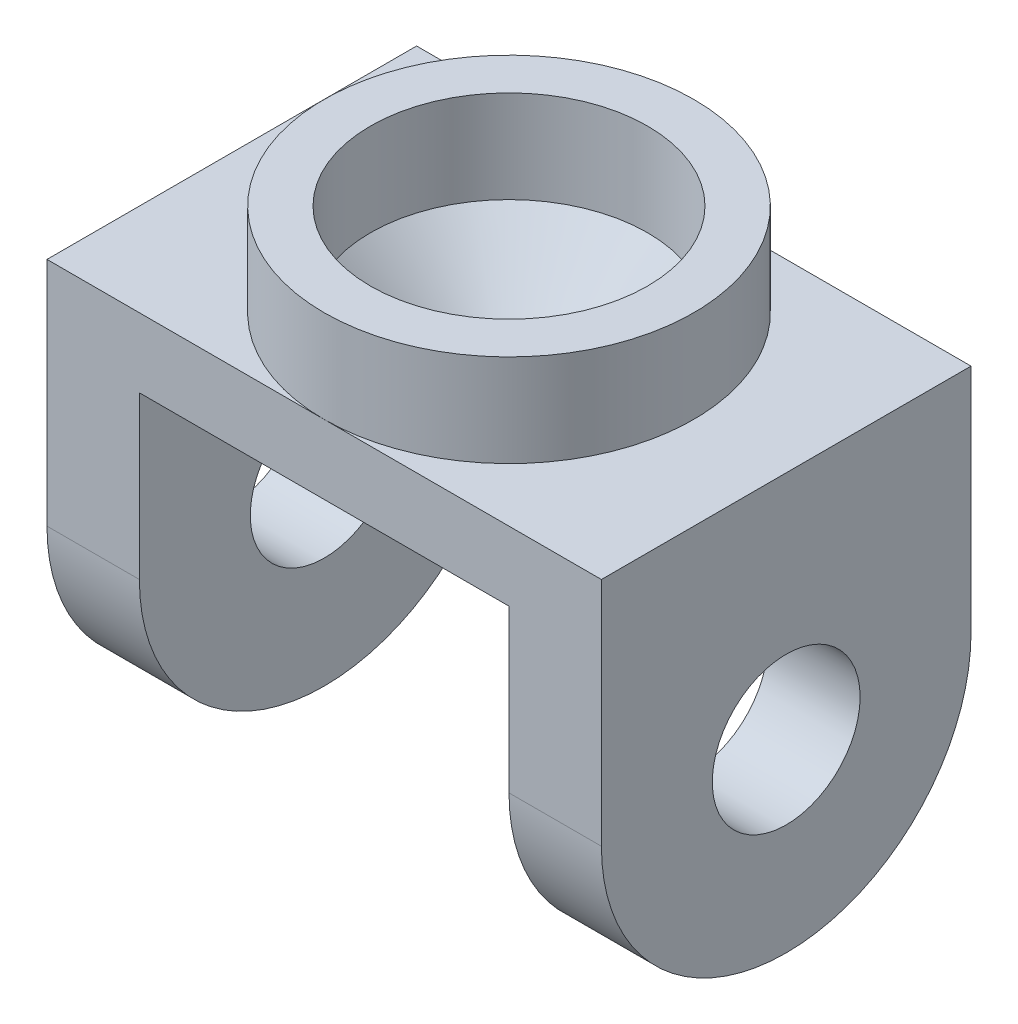
ISO-10303-21;
HEADER;
FILE_DESCRIPTION(('STEP AP214'),'2;1');
FILE_NAME('part.step','',(''),(''),'','','');
FILE_SCHEMA(('AUTOMOTIVE_DESIGN { 1 0 10303 214 1 1 1 1 }'));
ENDSEC;
DATA;
#1=APPLICATION_CONTEXT('core data for automotive mechanical design processes');
#2=APPLICATION_PROTOCOL_DEFINITION('international standard','automotive_design',2000,#1);
#3=PRODUCT_CONTEXT('',#1,'mechanical');
#4=PRODUCT('Part','Part','',(#3));
#5=PRODUCT_RELATED_PRODUCT_CATEGORY('part','',(#4));
#6=PRODUCT_DEFINITION_FORMATION('','',#4);
#7=PRODUCT_DEFINITION_CONTEXT('part definition',#1,'design');
#8=PRODUCT_DEFINITION('design','',#6,#7);
#9=PRODUCT_DEFINITION_SHAPE('','',#8);
#10=(LENGTH_UNIT() NAMED_UNIT(*) SI_UNIT(.MILLI.,.METRE.));
#11=(NAMED_UNIT(*) PLANE_ANGLE_UNIT() SI_UNIT($,.RADIAN.));
#12=(NAMED_UNIT(*) SI_UNIT($,.STERADIAN.) SOLID_ANGLE_UNIT());
#13=UNCERTAINTY_MEASURE_WITH_UNIT(LENGTH_MEASURE(1.E-05),#10,'distance_accuracy_value','');
#14=(GEOMETRIC_REPRESENTATION_CONTEXT(3) GLOBAL_UNCERTAINTY_ASSIGNED_CONTEXT((#13)) GLOBAL_UNIT_ASSIGNED_CONTEXT((#10,
#11,#12)) REPRESENTATION_CONTEXT('',''));
#15=CARTESIAN_POINT('',(0.,0.,0.));
#16=DIRECTION('',(0.,0.,1.));
#17=DIRECTION('',(1.,0.,0.));
#18=AXIS2_PLACEMENT_3D('',#15,#16,#17);
#19=CARTESIAN_POINT('',(0.,228.6,0.));
#20=DIRECTION('',(0.,-1.,0.));
#21=DIRECTION('',(0.,0.,-1.));
#22=AXIS2_PLACEMENT_3D('',#19,#20,#21);
#23=PLANE('',#22);
#24=CARTESIAN_POINT('',(0.,228.6,0.));
#25=DIRECTION('',(0.,1.,0.));
#26=DIRECTION('',(0.,0.,1.));
#27=AXIS2_PLACEMENT_3D('',#24,#25,#26);
#28=CIRCLE('',#27,101.6);
#29=CARTESIAN_POINT('',(0.,228.6,101.6));
#30=VERTEX_POINT('',#29);
#31=CARTESIAN_POINT('',(0.,228.6,-101.6));
#32=VERTEX_POINT('',#31);
#33=EDGE_CURVE('E165',#30,#32,#28,.T.);
#34=ORIENTED_EDGE('',*,*,#33,.F.);
#35=DIRECTION('',(1.,0.,0.));
#36=VECTOR('',#35,1.);
#37=CARTESIAN_POINT('',(-152.4,228.6,101.6));
#38=LINE('',#37,#36);
#39=CARTESIAN_POINT('',(152.4,228.6,101.6));
#40=VERTEX_POINT('',#39);
#41=EDGE_CURVE('E178',#30,#40,#38,.T.);
#42=ORIENTED_EDGE('',*,*,#41,.T.);
#43=DIRECTION('',(0.,0.,-1.));
#44=VECTOR('',#43,1.);
#45=CARTESIAN_POINT('',(152.4,228.6,101.6));
#46=LINE('',#45,#44);
#47=CARTESIAN_POINT('',(152.4,228.6,-101.6));
#48=VERTEX_POINT('',#47);
#49=EDGE_CURVE('E169',#40,#48,#46,.T.);
#50=ORIENTED_EDGE('',*,*,#49,.T.);
#51=DIRECTION('',(-1.,0.,0.));
#52=VECTOR('',#51,1.);
#53=CARTESIAN_POINT('',(-152.4,228.6,-101.6));
#54=LINE('',#53,#52);
#55=EDGE_CURVE('E175',#48,#32,#54,.T.);
#56=ORIENTED_EDGE('',*,*,#55,.T.);
#57=EDGE_LOOP('',(#34,#42,#50,#56));
#58=FACE_BOUND('',#57,.T.);
#59=ADVANCED_FACE('F41',(#58),#23,.F.);
#60=CARTESIAN_POINT('',(152.4,228.6,101.6));
#61=DIRECTION('',(-1.,0.,0.));
#62=DIRECTION('',(0.,0.,1.));
#63=AXIS2_PLACEMENT_3D('',#60,#61,#62);
#64=PLANE('',#63);
#65=CARTESIAN_POINT('',(152.4,101.6,0.));
#66=DIRECTION('',(1.,0.,0.));
#67=DIRECTION('',(0.,0.,-1.));
#68=AXIS2_PLACEMENT_3D('',#65,#66,#67);
#69=CIRCLE('',#68,40.64);
#70=CARTESIAN_POINT('',(152.4,101.6,-40.64));
#71=VERTEX_POINT('',#70);
#72=EDGE_CURVE('E219',#71,#71,#69,.T.);
#73=ORIENTED_EDGE('',*,*,#72,.F.);
#74=EDGE_LOOP('',(#73));
#75=FACE_BOUND('',#74,.T.);
#76=CARTESIAN_POINT('',(152.4,101.6,0.));
#77=DIRECTION('',(-1.,0.,0.));
#78=DIRECTION('',(0.,0.,1.));
#79=AXIS2_PLACEMENT_3D('',#76,#77,#78);
#80=CIRCLE('',#79,101.6);
#81=CARTESIAN_POINT('',(152.4,101.6,101.6));
#82=VERTEX_POINT('',#81);
#83=CARTESIAN_POINT('',(152.4,0.,0.));
#84=VERTEX_POINT('',#83);
#85=EDGE_CURVE('E208',#82,#84,#80,.F.);
#86=ORIENTED_EDGE('',*,*,#85,.T.);
#87=CARTESIAN_POINT('',(152.4,101.6,0.));
#88=DIRECTION('',(-1.,0.,0.));
#89=DIRECTION('',(0.,0.,1.));
#90=AXIS2_PLACEMENT_3D('',#87,#88,#89);
#91=CIRCLE('',#90,101.6);
#92=CARTESIAN_POINT('',(152.4,101.6,-101.6));
#93=VERTEX_POINT('',#92);
#94=EDGE_CURVE('E209',#84,#93,#91,.F.);
#95=ORIENTED_EDGE('',*,*,#94,.T.);
#96=DIRECTION('',(0.,-1.,0.));
#97=VECTOR('',#96,1.);
#98=CARTESIAN_POINT('',(152.4,228.6,-101.6));
#99=LINE('',#98,#97);
#100=EDGE_CURVE('E190',#48,#93,#99,.T.);
#101=ORIENTED_EDGE('',*,*,#100,.F.);
#102=ORIENTED_EDGE('',*,*,#49,.F.);
#103=DIRECTION('',(0.,-1.,0.));
#104=VECTOR('',#103,1.);
#105=CARTESIAN_POINT('',(152.4,228.6,101.6));
#106=LINE('',#105,#104);
#107=EDGE_CURVE('E181',#40,#82,#106,.T.);
#108=ORIENTED_EDGE('',*,*,#107,.T.);
#109=EDGE_LOOP('',(#86,#95,#101,#102,#108));
#110=FACE_BOUND('',#109,.T.);
#111=ADVANCED_FACE('F281',(#75,#110),#64,.F.);
#112=CARTESIAN_POINT('',(-152.4,228.6,-101.6));
#113=DIRECTION('',(0.,0.,1.));
#114=DIRECTION('',(1.,0.,0.));
#115=AXIS2_PLACEMENT_3D('',#112,#113,#114);
#116=PLANE('',#115);
#117=ORIENTED_EDGE('',*,*,#100,.T.);
#118=DIRECTION('',(-1.,0.,0.));
#119=VECTOR('',#118,1.);
#120=CARTESIAN_POINT('',(101.6,101.6,-101.6));
#121=LINE('',#120,#119);
#122=CARTESIAN_POINT('',(101.6,101.6,-101.6));
#123=VERTEX_POINT('',#122);
#124=EDGE_CURVE('E203',#93,#123,#121,.T.);
#125=ORIENTED_EDGE('',*,*,#124,.T.);
#126=DIRECTION('',(0.,-1.,0.));
#127=VECTOR('',#126,1.);
#128=CARTESIAN_POINT('',(101.6,190.5,-101.6));
#129=LINE('',#128,#127);
#130=CARTESIAN_POINT('',(101.6,190.5,-101.6));
#131=VERTEX_POINT('',#130);
#132=EDGE_CURVE('E147',#131,#123,#129,.T.);
#133=ORIENTED_EDGE('',*,*,#132,.F.);
#134=DIRECTION('',(1.,0.,0.));
#135=VECTOR('',#134,1.);
#136=CARTESIAN_POINT('',(-101.6,190.5,-101.6));
#137=LINE('',#136,#135);
#138=CARTESIAN_POINT('',(-101.6,190.5,-101.6));
#139=VERTEX_POINT('',#138);
#140=EDGE_CURVE('E133',#139,#131,#137,.T.);
#141=ORIENTED_EDGE('',*,*,#140,.F.);
#142=DIRECTION('',(0.,-1.,0.));
#143=VECTOR('',#142,1.);
#144=CARTESIAN_POINT('',(-101.6,190.5,-101.6));
#145=LINE('',#144,#143);
#146=CARTESIAN_POINT('',(-101.6,101.6,-101.6));
#147=VERTEX_POINT('',#146);
#148=EDGE_CURVE('E128',#139,#147,#145,.T.);
#149=ORIENTED_EDGE('',*,*,#148,.T.);
#150=DIRECTION('',(-1.,0.,0.));
#151=VECTOR('',#150,1.);
#152=CARTESIAN_POINT('',(-152.4,101.6,-101.6));
#153=LINE('',#152,#151);
#154=CARTESIAN_POINT('',(-152.4,101.6,-101.6));
#155=VERTEX_POINT('',#154);
#156=EDGE_CURVE('E196',#147,#155,#153,.T.);
#157=ORIENTED_EDGE('',*,*,#156,.T.);
#158=DIRECTION('',(0.,-1.,0.));
#159=VECTOR('',#158,1.);
#160=CARTESIAN_POINT('',(-152.4,228.6,-101.6));
#161=LINE('',#160,#159);
#162=CARTESIAN_POINT('',(-152.4,228.6,-101.6));
#163=VERTEX_POINT('',#162);
#164=EDGE_CURVE('E189',#163,#155,#161,.T.);
#165=ORIENTED_EDGE('',*,*,#164,.F.);
#166=EDGE_CURVE('E173',#32,#163,#54,.T.);
#167=ORIENTED_EDGE('',*,*,#166,.F.);
#168=ORIENTED_EDGE('',*,*,#55,.F.);
#169=EDGE_LOOP('',(#117,#125,#133,#141,#149,#157,#165,#167,#168));
#170=FACE_BOUND('',#169,.T.);
#171=ADVANCED_FACE('F247',(#170),#116,.F.);
#172=CARTESIAN_POINT('',(-152.4,228.6,101.6));
#173=DIRECTION('',(1.,0.,0.));
#174=DIRECTION('',(0.,0.,-1.));
#175=AXIS2_PLACEMENT_3D('',#172,#173,#174);
#176=PLANE('',#175);
#177=CARTESIAN_POINT('',(-152.4,101.6,0.));
#178=DIRECTION('',(1.,0.,0.));
#179=DIRECTION('',(0.,0.,-1.));
#180=AXIS2_PLACEMENT_3D('',#177,#178,#179);
#181=CIRCLE('',#180,40.64);
#182=CARTESIAN_POINT('',(-152.4,101.6,-40.64));
#183=VERTEX_POINT('',#182);
#184=EDGE_CURVE('E197',#183,#183,#181,.T.);
#185=ORIENTED_EDGE('',*,*,#184,.T.);
#186=EDGE_LOOP('',(#185));
#187=FACE_BOUND('',#186,.T.);
#188=ORIENTED_EDGE('',*,*,#164,.T.);
#189=CARTESIAN_POINT('',(-152.4,101.6,0.));
#190=DIRECTION('',(1.,0.,0.));
#191=DIRECTION('',(0.,0.,-1.));
#192=AXIS2_PLACEMENT_3D('',#189,#190,#191);
#193=CIRCLE('',#192,101.6);
#194=CARTESIAN_POINT('',(-152.4,0.,0.));
#195=VERTEX_POINT('',#194);
#196=EDGE_CURVE('E65',#155,#195,#193,.F.);
#197=ORIENTED_EDGE('',*,*,#196,.T.);
#198=CARTESIAN_POINT('',(-152.4,101.6,0.));
#199=DIRECTION('',(1.,0.,0.));
#200=DIRECTION('',(0.,0.,-1.));
#201=AXIS2_PLACEMENT_3D('',#198,#199,#200);
#202=CIRCLE('',#201,101.6);
#203=CARTESIAN_POINT('',(-152.4,101.6,101.6));
#204=VERTEX_POINT('',#203);
#205=EDGE_CURVE('E214',#195,#204,#202,.F.);
#206=ORIENTED_EDGE('',*,*,#205,.T.);
#207=DIRECTION('',(0.,-1.,0.));
#208=VECTOR('',#207,1.);
#209=CARTESIAN_POINT('',(-152.4,228.6,101.6));
#210=LINE('',#209,#208);
#211=CARTESIAN_POINT('',(-152.4,228.6,101.6));
#212=VERTEX_POINT('',#211);
#213=EDGE_CURVE('E186',#212,#204,#210,.T.);
#214=ORIENTED_EDGE('',*,*,#213,.F.);
#215=DIRECTION('',(0.,0.,1.));
#216=VECTOR('',#215,1.);
#217=CARTESIAN_POINT('',(-152.4,228.6,101.6));
#218=LINE('',#217,#216);
#219=EDGE_CURVE('E179',#163,#212,#218,.T.);
#220=ORIENTED_EDGE('',*,*,#219,.F.);
#221=EDGE_LOOP('',(#188,#197,#206,#214,#220));
#222=FACE_BOUND('',#221,.T.);
#223=ADVANCED_FACE('F231',(#187,#222),#176,.F.);
#224=CARTESIAN_POINT('',(-152.4,228.6,101.6));
#225=DIRECTION('',(0.,0.,-1.));
#226=DIRECTION('',(-1.,0.,0.));
#227=AXIS2_PLACEMENT_3D('',#224,#225,#226);
#228=PLANE('',#227);
#229=DIRECTION('',(0.,-1.,0.));
#230=VECTOR('',#229,1.);
#231=CARTESIAN_POINT('',(101.6,190.5,101.6));
#232=LINE('',#231,#230);
#233=CARTESIAN_POINT('',(101.6,190.5,101.6));
#234=VERTEX_POINT('',#233);
#235=CARTESIAN_POINT('',(101.6,101.6,101.6));
#236=VERTEX_POINT('',#235);
#237=EDGE_CURVE('E146',#234,#236,#232,.T.);
#238=ORIENTED_EDGE('',*,*,#237,.T.);
#239=DIRECTION('',(1.,0.,0.));
#240=VECTOR('',#239,1.);
#241=CARTESIAN_POINT('',(152.4,101.6,101.6));
#242=LINE('',#241,#240);
#243=EDGE_CURVE('E213',#236,#82,#242,.T.);
#244=ORIENTED_EDGE('',*,*,#243,.T.);
#245=ORIENTED_EDGE('',*,*,#107,.F.);
#246=ORIENTED_EDGE('',*,*,#41,.F.);
#247=EDGE_CURVE('E182',#212,#30,#38,.T.);
#248=ORIENTED_EDGE('',*,*,#247,.F.);
#249=ORIENTED_EDGE('',*,*,#213,.T.);
#250=DIRECTION('',(1.,0.,0.));
#251=VECTOR('',#250,1.);
#252=CARTESIAN_POINT('',(-101.6,101.6,101.6));
#253=LINE('',#252,#251);
#254=CARTESIAN_POINT('',(-101.6,101.6,101.6));
#255=VERTEX_POINT('',#254);
#256=EDGE_CURVE('E150',#204,#255,#253,.T.);
#257=ORIENTED_EDGE('',*,*,#256,.T.);
#258=DIRECTION('',(0.,-1.,0.));
#259=VECTOR('',#258,1.);
#260=CARTESIAN_POINT('',(-101.6,190.5,101.6));
#261=LINE('',#260,#259);
#262=CARTESIAN_POINT('',(-101.6,190.5,101.6));
#263=VERTEX_POINT('',#262);
#264=EDGE_CURVE('E126',#263,#255,#261,.T.);
#265=ORIENTED_EDGE('',*,*,#264,.F.);
#266=DIRECTION('',(-1.,0.,0.));
#267=VECTOR('',#266,1.);
#268=CARTESIAN_POINT('',(-101.6,190.5,101.6));
#269=LINE('',#268,#267);
#270=EDGE_CURVE('E135',#234,#263,#269,.T.);
#271=ORIENTED_EDGE('',*,*,#270,.F.);
#272=EDGE_LOOP('',(#238,#244,#245,#246,#248,#249,#257,#265,#271));
#273=FACE_BOUND('',#272,.T.);
#274=ADVANCED_FACE('F145',(#273),#228,.F.);
#275=EDGE_CURVE('E171',#32,#30,#28,.T.);
#276=ORIENTED_EDGE('',*,*,#275,.F.);
#277=ORIENTED_EDGE('',*,*,#166,.T.);
#278=ORIENTED_EDGE('',*,*,#219,.T.);
#279=ORIENTED_EDGE('',*,*,#247,.T.);
#280=EDGE_LOOP('',(#276,#277,#278,#279));
#281=FACE_BOUND('',#280,.T.);
#282=ADVANCED_FACE('F241',(#281),#23,.F.);
#283=CARTESIAN_POINT('',(0.,279.4,0.));
#284=DIRECTION('',(0.,1.,0.));
#285=DIRECTION('',(0.,0.,1.));
#286=AXIS2_PLACEMENT_3D('',#283,#284,#285);
#287=PLANE('',#286);
#288=CARTESIAN_POINT('',(0.,279.4,0.));
#289=DIRECTION('',(0.,1.,0.));
#290=DIRECTION('',(0.,0.,1.));
#291=AXIS2_PLACEMENT_3D('',#288,#289,#290);
#292=CIRCLE('',#291,101.6);
#293=CARTESIAN_POINT('',(0.,279.4,101.6));
#294=VERTEX_POINT('',#293);
#295=EDGE_CURVE('E164',#294,#294,#292,.T.);
#296=ORIENTED_EDGE('',*,*,#295,.T.);
#297=EDGE_LOOP('',(#296));
#298=FACE_BOUND('',#297,.T.);
#299=CARTESIAN_POINT('',(0.,279.4,0.));
#300=DIRECTION('',(0.,1.,0.));
#301=DIRECTION('',(0.,0.,1.));
#302=AXIS2_PLACEMENT_3D('',#299,#300,#301);
#303=CIRCLE('',#302,76.2);
#304=CARTESIAN_POINT('',(0.,279.4,76.2));
#305=VERTEX_POINT('',#304);
#306=EDGE_CURVE('E157',#305,#305,#303,.T.);
#307=ORIENTED_EDGE('',*,*,#306,.F.);
#308=EDGE_LOOP('',(#307));
#309=FACE_BOUND('',#308,.T.);
#310=ADVANCED_FACE('F295',(#298,#309),#287,.T.);
#311=CARTESIAN_POINT('',(0.,279.4,0.));
#312=DIRECTION('',(0.,-1.,0.));
#313=DIRECTION('',(0.,0.,-1.));
#314=AXIS2_PLACEMENT_3D('',#311,#312,#313);
#315=CYLINDRICAL_SURFACE('',#314,101.6);
#316=ORIENTED_EDGE('',*,*,#295,.F.);
#317=EDGE_LOOP('',(#316));
#318=FACE_BOUND('',#317,.T.);
#319=ORIENTED_EDGE('',*,*,#33,.T.);
#320=ORIENTED_EDGE('',*,*,#275,.T.);
#321=EDGE_LOOP('',(#319,#320));
#322=FACE_BOUND('',#321,.T.);
#323=ADVANCED_FACE('F296',(#318,#322),#315,.T.);
#324=CARTESIAN_POINT('',(0.,279.4,0.));
#325=DIRECTION('',(0.,-1.,0.));
#326=DIRECTION('',(0.,0.,-1.));
#327=AXIS2_PLACEMENT_3D('',#324,#325,#326);
#328=CYLINDRICAL_SURFACE('',#327,76.2);
#329=ORIENTED_EDGE('',*,*,#306,.T.);
#330=EDGE_LOOP('',(#329));
#331=FACE_BOUND('',#330,.T.);
#332=CARTESIAN_POINT('',(0.,228.6,0.));
#333=DIRECTION('',(0.,1.,0.));
#334=DIRECTION('',(0.,0.,1.));
#335=AXIS2_PLACEMENT_3D('',#332,#333,#334);
#336=CIRCLE('',#335,76.2);
#337=CARTESIAN_POINT('',(0.,228.6,76.2));
#338=VERTEX_POINT('',#337);
#339=EDGE_CURVE('E158',#338,#338,#336,.T.);
#340=ORIENTED_EDGE('',*,*,#339,.F.);
#341=EDGE_LOOP('',(#340));
#342=FACE_BOUND('',#341,.T.);
#343=ADVANCED_FACE('F280',(#331,#342),#328,.F.);
#344=CARTESIAN_POINT('',(101.6,190.5,-101.6));
#345=DIRECTION('',(1.,0.,0.));
#346=DIRECTION('',(0.,0.,-1.));
#347=AXIS2_PLACEMENT_3D('',#344,#345,#346);
#348=PLANE('',#347);
#349=CARTESIAN_POINT('',(101.6,101.6,0.));
#350=DIRECTION('',(1.,0.,0.));
#351=DIRECTION('',(0.,0.,-1.));
#352=AXIS2_PLACEMENT_3D('',#349,#350,#351);
#353=CIRCLE('',#352,40.64);
#354=CARTESIAN_POINT('',(101.6,101.6,-40.64));
#355=VERTEX_POINT('',#354);
#356=EDGE_CURVE('E198',#355,#355,#353,.T.);
#357=ORIENTED_EDGE('',*,*,#356,.T.);
#358=EDGE_LOOP('',(#357));
#359=FACE_BOUND('',#358,.T.);
#360=ORIENTED_EDGE('',*,*,#132,.T.);
#361=CARTESIAN_POINT('',(101.6,101.6,0.));
#362=DIRECTION('',(1.,0.,0.));
#363=DIRECTION('',(0.,0.,-1.));
#364=AXIS2_PLACEMENT_3D('',#361,#362,#363);
#365=CIRCLE('',#364,101.6);
#366=CARTESIAN_POINT('',(101.6,0.,0.));
#367=VERTEX_POINT('',#366);
#368=EDGE_CURVE('E206',#123,#367,#365,.F.);
#369=ORIENTED_EDGE('',*,*,#368,.T.);
#370=CARTESIAN_POINT('',(101.6,101.6,0.));
#371=DIRECTION('',(1.,0.,0.));
#372=DIRECTION('',(0.,0.,-1.));
#373=AXIS2_PLACEMENT_3D('',#370,#371,#372);
#374=CIRCLE('',#373,101.6);
#375=EDGE_CURVE('E204',#367,#236,#374,.F.);
#376=ORIENTED_EDGE('',*,*,#375,.T.);
#377=ORIENTED_EDGE('',*,*,#237,.F.);
#378=DIRECTION('',(0.,0.,1.));
#379=VECTOR('',#378,1.);
#380=CARTESIAN_POINT('',(101.6,190.5,-101.6));
#381=LINE('',#380,#379);
#382=EDGE_CURVE('E136',#131,#234,#381,.T.);
#383=ORIENTED_EDGE('',*,*,#382,.F.);
#384=EDGE_LOOP('',(#360,#369,#376,#377,#383));
#385=FACE_BOUND('',#384,.T.);
#386=ADVANCED_FACE('F253',(#359,#385),#348,.F.);
#387=CARTESIAN_POINT('',(-101.6,190.5,-101.6));
#388=DIRECTION('',(-1.,0.,0.));
#389=DIRECTION('',(0.,0.,1.));
#390=AXIS2_PLACEMENT_3D('',#387,#388,#389);
#391=PLANE('',#390);
#392=CARTESIAN_POINT('',(-101.6,101.6,0.));
#393=DIRECTION('',(-1.,0.,0.));
#394=DIRECTION('',(0.,0.,1.));
#395=AXIS2_PLACEMENT_3D('',#392,#393,#394);
#396=CIRCLE('',#395,40.64);
#397=CARTESIAN_POINT('',(-101.6,101.6,-40.64));
#398=VERTEX_POINT('',#397);
#399=EDGE_CURVE('E194',#398,#398,#396,.T.);
#400=ORIENTED_EDGE('',*,*,#399,.T.);
#401=EDGE_LOOP('',(#400));
#402=FACE_BOUND('',#401,.T.);
#403=CARTESIAN_POINT('',(-101.6,101.6,0.));
#404=DIRECTION('',(-1.,0.,0.));
#405=DIRECTION('',(0.,0.,1.));
#406=AXIS2_PLACEMENT_3D('',#403,#404,#405);
#407=CIRCLE('',#406,101.6);
#408=CARTESIAN_POINT('',(-101.6,0.,0.));
#409=VERTEX_POINT('',#408);
#410=EDGE_CURVE('E51',#255,#409,#407,.F.);
#411=ORIENTED_EDGE('',*,*,#410,.T.);
#412=CARTESIAN_POINT('',(-101.6,101.6,0.));
#413=DIRECTION('',(-1.,0.,0.));
#414=DIRECTION('',(0.,0.,1.));
#415=AXIS2_PLACEMENT_3D('',#412,#413,#414);
#416=CIRCLE('',#415,101.6);
#417=EDGE_CURVE('E11',#409,#147,#416,.F.);
#418=ORIENTED_EDGE('',*,*,#417,.T.);
#419=ORIENTED_EDGE('',*,*,#148,.F.);
#420=DIRECTION('',(0.,0.,-1.));
#421=VECTOR('',#420,1.);
#422=CARTESIAN_POINT('',(-101.6,190.5,-101.6));
#423=LINE('',#422,#421);
#424=EDGE_CURVE('E121',#263,#139,#423,.T.);
#425=ORIENTED_EDGE('',*,*,#424,.F.);
#426=ORIENTED_EDGE('',*,*,#264,.T.);
#427=EDGE_LOOP('',(#411,#418,#419,#425,#426));
#428=FACE_BOUND('',#427,.T.);
#429=ADVANCED_FACE('F127',(#402,#428),#391,.F.);
#430=CARTESIAN_POINT('',(0.,190.5,0.));
#431=DIRECTION('',(0.,1.,0.));
#432=DIRECTION('',(0.,0.,1.));
#433=AXIS2_PLACEMENT_3D('',#430,#431,#432);
#434=PLANE('',#433);
#435=CARTESIAN_POINT('',(0.,190.5,0.));
#436=DIRECTION('',(0.,1.,0.));
#437=DIRECTION('',(0.,0.,1.));
#438=AXIS2_PLACEMENT_3D('',#435,#436,#437);
#439=CIRCLE('',#438,38.1);
#440=CARTESIAN_POINT('',(0.,190.5,38.1));
#441=VERTEX_POINT('',#440);
#442=EDGE_CURVE('E154',#441,#441,#439,.T.);
#443=ORIENTED_EDGE('',*,*,#442,.T.);
#444=EDGE_LOOP('',(#443));
#445=FACE_BOUND('',#444,.T.);
#446=ORIENTED_EDGE('',*,*,#382,.T.);
#447=ORIENTED_EDGE('',*,*,#270,.T.);
#448=ORIENTED_EDGE('',*,*,#424,.T.);
#449=ORIENTED_EDGE('',*,*,#140,.T.);
#450=EDGE_LOOP('',(#446,#447,#448,#449));
#451=FACE_BOUND('',#450,.T.);
#452=ADVANCED_FACE('F139',(#445,#451),#434,.F.);
#453=CARTESIAN_POINT('',(-152.4,101.6,0.));
#454=DIRECTION('',(1.,0.,0.));
#455=DIRECTION('',(0.,0.,-1.));
#456=AXIS2_PLACEMENT_3D('',#453,#454,#455);
#457=CYLINDRICAL_SURFACE('',#456,40.64);
#458=CARTESIAN_POINT('',(-152.4,101.6,-40.64));
#459=CARTESIAN_POINT('',(-151.870833333333,101.6,-40.64));
#460=CARTESIAN_POINT('',(-151.341666666667,101.6,-40.64));
#461=CARTESIAN_POINT('',(-150.283333333333,101.6,-40.64));
#462=CARTESIAN_POINT('',(-149.754166666667,101.6,-40.64));
#463=CARTESIAN_POINT('',(-148.695833333333,101.6,-40.64));
#464=CARTESIAN_POINT('',(-148.166666666667,101.6,-40.64));
#465=CARTESIAN_POINT('',(-147.108333333333,101.6,-40.64));
#466=CARTESIAN_POINT('',(-146.579166666667,101.6,-40.64));
#467=CARTESIAN_POINT('',(-145.520833333333,101.6,-40.64));
#468=CARTESIAN_POINT('',(-144.991666666667,101.6,-40.64));
#469=CARTESIAN_POINT('',(-143.933333333333,101.6,-40.64));
#470=CARTESIAN_POINT('',(-143.404166666667,101.6,-40.64));
#471=CARTESIAN_POINT('',(-142.345833333333,101.6,-40.64));
#472=CARTESIAN_POINT('',(-141.816666666667,101.6,-40.64));
#473=CARTESIAN_POINT('',(-140.758333333333,101.6,-40.64));
#474=CARTESIAN_POINT('',(-140.229166666667,101.6,-40.64));
#475=CARTESIAN_POINT('',(-139.170833333333,101.6,-40.64));
#476=CARTESIAN_POINT('',(-138.641666666667,101.6,-40.64));
#477=CARTESIAN_POINT('',(-137.583333333333,101.6,-40.64));
#478=CARTESIAN_POINT('',(-137.054166666667,101.6,-40.64));
#479=CARTESIAN_POINT('',(-135.995833333333,101.6,-40.64));
#480=CARTESIAN_POINT('',(-135.466666666667,101.6,-40.64));
#481=CARTESIAN_POINT('',(-134.408333333333,101.6,-40.64));
#482=CARTESIAN_POINT('',(-133.879166666667,101.6,-40.64));
#483=CARTESIAN_POINT('',(-132.820833333333,101.6,-40.64));
#484=CARTESIAN_POINT('',(-132.291666666667,101.6,-40.64));
#485=CARTESIAN_POINT('',(-131.233333333333,101.6,-40.64));
#486=CARTESIAN_POINT('',(-130.704166666667,101.6,-40.64));
#487=CARTESIAN_POINT('',(-129.645833333333,101.6,-40.64));
#488=CARTESIAN_POINT('',(-129.116666666667,101.6,-40.64));
#489=CARTESIAN_POINT('',(-128.058333333333,101.6,-40.64));
#490=CARTESIAN_POINT('',(-127.529166666667,101.6,-40.64));
#491=CARTESIAN_POINT('',(-126.470833333333,101.6,-40.64));
#492=CARTESIAN_POINT('',(-125.941666666667,101.6,-40.64));
#493=CARTESIAN_POINT('',(-124.883333333333,101.6,-40.64));
#494=CARTESIAN_POINT('',(-124.354166666667,101.6,-40.64));
#495=CARTESIAN_POINT('',(-123.295833333333,101.6,-40.64));
#496=CARTESIAN_POINT('',(-122.766666666667,101.6,-40.64));
#497=CARTESIAN_POINT('',(-121.708333333333,101.6,-40.64));
#498=CARTESIAN_POINT('',(-121.179166666667,101.6,-40.64));
#499=CARTESIAN_POINT('',(-120.120833333333,101.6,-40.64));
#500=CARTESIAN_POINT('',(-119.591666666667,101.6,-40.64));
#501=CARTESIAN_POINT('',(-118.533333333333,101.6,-40.64));
#502=CARTESIAN_POINT('',(-118.004166666667,101.6,-40.64));
#503=CARTESIAN_POINT('',(-116.945833333333,101.6,-40.64));
#504=CARTESIAN_POINT('',(-116.416666666667,101.6,-40.64));
#505=CARTESIAN_POINT('',(-115.358333333333,101.6,-40.64));
#506=CARTESIAN_POINT('',(-114.829166666667,101.6,-40.64));
#507=CARTESIAN_POINT('',(-113.770833333333,101.6,-40.64));
#508=CARTESIAN_POINT('',(-113.241666666667,101.6,-40.64));
#509=CARTESIAN_POINT('',(-112.183333333333,101.6,-40.64));
#510=CARTESIAN_POINT('',(-111.654166666667,101.6,-40.64));
#511=CARTESIAN_POINT('',(-110.595833333333,101.6,-40.64));
#512=CARTESIAN_POINT('',(-110.066666666667,101.6,-40.64));
#513=CARTESIAN_POINT('',(-109.008333333333,101.6,-40.64));
#514=CARTESIAN_POINT('',(-108.479166666667,101.6,-40.64));
#515=CARTESIAN_POINT('',(-107.420833333333,101.6,-40.64));
#516=CARTESIAN_POINT('',(-106.891666666667,101.6,-40.64));
#517=CARTESIAN_POINT('',(-105.833333333333,101.6,-40.64));
#518=CARTESIAN_POINT('',(-105.304166666667,101.6,-40.64));
#519=CARTESIAN_POINT('',(-104.245833333333,101.6,-40.64));
#520=CARTESIAN_POINT('',(-103.716666666667,101.6,-40.64));
#521=CARTESIAN_POINT('',(-102.658333333333,101.6,-40.64));
#522=CARTESIAN_POINT('',(-102.129166666667,101.6,-40.64));
#523=CARTESIAN_POINT('',(-101.6,101.6,-40.64));
#524=B_SPLINE_CURVE_WITH_KNOTS('',3,(#458,#459,#460,#461,#462,#463,#464,#465,#466,#467,#468,
#469,#470,#471,#472,#473,#474,#475,#476,#477,#478,#479,#480,#481,#482,#483,#484,#485,#486,#487,
#488,#489,#490,#491,#492,#493,#494,#495,#496,#497,#498,#499,#500,#501,#502,#503,#504,#505,#506,
#507,#508,#509,#510,#511,#512,#513,#514,#515,#516,#517,#518,#519,#520,#521,#522,#523),
.UNSPECIFIED.,.F.,.F.,(4,2,2,2,2,2,2,2,2,2,2,2,2,2,2,2,2,2,2,2,2,2,2,2,2,2,2,2,2,2,2,2,4),(0.,
1.58750000000002,3.17500000000001,4.76250000000003,6.35000000000002,7.93750000000001,
9.52500000000003,11.1125,12.7,14.2875,15.875,17.4625,19.05,20.6375000000001,22.2250000000001,
23.8125,25.4000000000001,26.9875000000001,28.5750000000001,30.1625000000001,31.7500000000001,
33.3375000000001,34.9250000000001,36.5125000000001,38.1000000000001,39.6875000000001,
41.2750000000001,42.8625000000001,44.4500000000001,46.0375000000001,47.6250000000001,
49.2125000000001,50.8000000000001),.UNSPECIFIED.);
#525=EDGE_CURVE('BSEAM261',#183,#398,#524,.T.);
#526=ORIENTED_EDGE('',*,*,#184,.F.);
#527=ORIENTED_EDGE('',*,*,#399,.F.);
#528=ORIENTED_EDGE('',*,*,#525,.T.);
#529=ORIENTED_EDGE('',*,*,#525,.F.);
#530=EDGE_LOOP('',(#526,#528,#527,#529));
#531=FACE_BOUND('',#530,.T.);
#532=ADVANCED_FACE('F261',(#531),#457,.F.);
#533=CARTESIAN_POINT('',(152.4,101.6,-40.64));
#534=CARTESIAN_POINT('',(151.870833333333,101.6,-40.64));
#535=CARTESIAN_POINT('',(151.341666666667,101.6,-40.64));
#536=CARTESIAN_POINT('',(150.283333333333,101.6,-40.64));
#537=CARTESIAN_POINT('',(149.754166666667,101.6,-40.64));
#538=CARTESIAN_POINT('',(148.695833333333,101.6,-40.64));
#539=CARTESIAN_POINT('',(148.166666666667,101.6,-40.64));
#540=CARTESIAN_POINT('',(147.108333333333,101.6,-40.64));
#541=CARTESIAN_POINT('',(146.579166666667,101.6,-40.64));
#542=CARTESIAN_POINT('',(145.520833333333,101.6,-40.64));
#543=CARTESIAN_POINT('',(144.991666666667,101.6,-40.64));
#544=CARTESIAN_POINT('',(143.933333333333,101.6,-40.64));
#545=CARTESIAN_POINT('',(143.404166666667,101.6,-40.64));
#546=CARTESIAN_POINT('',(142.345833333333,101.6,-40.64));
#547=CARTESIAN_POINT('',(141.816666666667,101.6,-40.64));
#548=CARTESIAN_POINT('',(140.758333333333,101.6,-40.64));
#549=CARTESIAN_POINT('',(140.229166666667,101.6,-40.64));
#550=CARTESIAN_POINT('',(139.170833333333,101.6,-40.64));
#551=CARTESIAN_POINT('',(138.641666666667,101.6,-40.64));
#552=CARTESIAN_POINT('',(137.583333333333,101.6,-40.64));
#553=CARTESIAN_POINT('',(137.054166666667,101.6,-40.64));
#554=CARTESIAN_POINT('',(135.995833333333,101.6,-40.64));
#555=CARTESIAN_POINT('',(135.466666666667,101.6,-40.64));
#556=CARTESIAN_POINT('',(134.408333333333,101.6,-40.64));
#557=CARTESIAN_POINT('',(133.879166666667,101.6,-40.64));
#558=CARTESIAN_POINT('',(132.820833333333,101.6,-40.64));
#559=CARTESIAN_POINT('',(132.291666666667,101.6,-40.64));
#560=CARTESIAN_POINT('',(131.233333333333,101.6,-40.64));
#561=CARTESIAN_POINT('',(130.704166666667,101.6,-40.64));
#562=CARTESIAN_POINT('',(129.645833333333,101.6,-40.64));
#563=CARTESIAN_POINT('',(129.116666666667,101.6,-40.64));
#564=CARTESIAN_POINT('',(128.058333333333,101.6,-40.64));
#565=CARTESIAN_POINT('',(127.529166666667,101.6,-40.64));
#566=CARTESIAN_POINT('',(126.470833333333,101.6,-40.64));
#567=CARTESIAN_POINT('',(125.941666666667,101.6,-40.64));
#568=CARTESIAN_POINT('',(124.883333333333,101.6,-40.64));
#569=CARTESIAN_POINT('',(124.354166666667,101.6,-40.64));
#570=CARTESIAN_POINT('',(123.295833333333,101.6,-40.64));
#571=CARTESIAN_POINT('',(122.766666666667,101.6,-40.64));
#572=CARTESIAN_POINT('',(121.708333333333,101.6,-40.64));
#573=CARTESIAN_POINT('',(121.179166666667,101.6,-40.64));
#574=CARTESIAN_POINT('',(120.120833333333,101.6,-40.64));
#575=CARTESIAN_POINT('',(119.591666666667,101.6,-40.64));
#576=CARTESIAN_POINT('',(118.533333333333,101.6,-40.64));
#577=CARTESIAN_POINT('',(118.004166666667,101.6,-40.64));
#578=CARTESIAN_POINT('',(116.945833333333,101.6,-40.64));
#579=CARTESIAN_POINT('',(116.416666666667,101.6,-40.64));
#580=CARTESIAN_POINT('',(115.358333333333,101.6,-40.64));
#581=CARTESIAN_POINT('',(114.829166666667,101.6,-40.64));
#582=CARTESIAN_POINT('',(113.770833333333,101.6,-40.64));
#583=CARTESIAN_POINT('',(113.241666666667,101.6,-40.64));
#584=CARTESIAN_POINT('',(112.183333333333,101.6,-40.64));
#585=CARTESIAN_POINT('',(111.654166666667,101.6,-40.64));
#586=CARTESIAN_POINT('',(110.595833333333,101.6,-40.64));
#587=CARTESIAN_POINT('',(110.066666666667,101.6,-40.64));
#588=CARTESIAN_POINT('',(109.008333333333,101.6,-40.64));
#589=CARTESIAN_POINT('',(108.479166666667,101.6,-40.64));
#590=CARTESIAN_POINT('',(107.420833333333,101.6,-40.64));
#591=CARTESIAN_POINT('',(106.891666666667,101.6,-40.64));
#592=CARTESIAN_POINT('',(105.833333333333,101.6,-40.64));
#593=CARTESIAN_POINT('',(105.304166666667,101.6,-40.64));
#594=CARTESIAN_POINT('',(104.245833333333,101.6,-40.64));
#595=CARTESIAN_POINT('',(103.716666666667,101.6,-40.64));
#596=CARTESIAN_POINT('',(102.658333333333,101.6,-40.64));
#597=CARTESIAN_POINT('',(102.129166666667,101.6,-40.64));
#598=CARTESIAN_POINT('',(101.6,101.6,-40.64));
#599=B_SPLINE_CURVE_WITH_KNOTS('',3,(#533,#534,#535,#536,#537,#538,#539,#540,#541,#542,#543,
#544,#545,#546,#547,#548,#549,#550,#551,#552,#553,#554,#555,#556,#557,#558,#559,#560,#561,#562,
#563,#564,#565,#566,#567,#568,#569,#570,#571,#572,#573,#574,#575,#576,#577,#578,#579,#580,#581,
#582,#583,#584,#585,#586,#587,#588,#589,#590,#591,#592,#593,#594,#595,#596,#597,#598),
.UNSPECIFIED.,.F.,.F.,(4,2,2,2,2,2,2,2,2,2,2,2,2,2,2,2,2,2,2,2,2,2,2,2,2,2,2,2,2,2,2,2,4),(0.,
1.58750000000002,3.17499999999998,4.7625,6.34999999999997,7.93749999999999,9.52500000000001,
11.1125,12.7,14.2875,15.875,17.4625,19.05,20.6375,22.225,23.8125,25.4,26.9875,28.575,30.1625,
31.7499999999999,33.3375,34.925,36.5124999999999,38.1,39.6875,41.2749999999999,42.8625,44.45,
46.0375,47.625,49.2124999999999,50.8),.UNSPECIFIED.);
#600=EDGE_CURVE('BSEAM262',#71,#355,#599,.T.);
#601=ORIENTED_EDGE('',*,*,#72,.T.);
#602=ORIENTED_EDGE('',*,*,#356,.F.);
#603=ORIENTED_EDGE('',*,*,#600,.T.);
#604=ORIENTED_EDGE('',*,*,#600,.F.);
#605=EDGE_LOOP('',(#601,#603,#602,#604));
#606=FACE_BOUND('',#605,.T.);
#607=ADVANCED_FACE('F262',(#606),#457,.F.);
#608=CARTESIAN_POINT('',(-152.4,101.6,0.));
#609=DIRECTION('',(-1.,0.,0.));
#610=DIRECTION('',(0.,0.,1.));
#611=AXIS2_PLACEMENT_3D('',#608,#609,#610);
#612=CYLINDRICAL_SURFACE('',#611,101.6);
#613=DIRECTION('',(1.,0.,0.));
#614=VECTOR('',#613,1.);
#615=CARTESIAN_POINT('',(101.6,0.,0.));
#616=LINE('',#615,#614);
#617=EDGE_CURVE('E217',#84,#367,#616,.F.);
#618=ORIENTED_EDGE('',*,*,#617,.F.);
#619=ORIENTED_EDGE('',*,*,#85,.F.);
#620=ORIENTED_EDGE('',*,*,#243,.F.);
#621=ORIENTED_EDGE('',*,*,#375,.F.);
#622=EDGE_LOOP('',(#618,#619,#620,#621));
#623=FACE_BOUND('',#622,.T.);
#624=ADVANCED_FACE('F309',(#623),#612,.T.);
#625=CARTESIAN_POINT('',(-152.4,101.6,0.));
#626=DIRECTION('',(1.,0.,0.));
#627=DIRECTION('',(0.,0.,-1.));
#628=AXIS2_PLACEMENT_3D('',#625,#626,#627);
#629=CYLINDRICAL_SURFACE('',#628,101.6);
#630=ORIENTED_EDGE('',*,*,#94,.F.);
#631=ORIENTED_EDGE('',*,*,#617,.T.);
#632=ORIENTED_EDGE('',*,*,#368,.F.);
#633=ORIENTED_EDGE('',*,*,#124,.F.);
#634=EDGE_LOOP('',(#630,#631,#632,#633));
#635=FACE_BOUND('',#634,.T.);
#636=ADVANCED_FACE('F307',(#635),#629,.T.);
#637=CARTESIAN_POINT('',(-152.4,101.6,0.));
#638=DIRECTION('',(-1.,0.,0.));
#639=DIRECTION('',(0.,0.,1.));
#640=AXIS2_PLACEMENT_3D('',#637,#638,#639);
#641=CYLINDRICAL_SURFACE('',#640,101.6);
#642=DIRECTION('',(1.,0.,0.));
#643=VECTOR('',#642,1.);
#644=CARTESIAN_POINT('',(-152.4,0.,0.));
#645=LINE('',#644,#643);
#646=EDGE_CURVE('E46',#409,#195,#645,.F.);
#647=ORIENTED_EDGE('',*,*,#646,.F.);
#648=ORIENTED_EDGE('',*,*,#410,.F.);
#649=ORIENTED_EDGE('',*,*,#256,.F.);
#650=ORIENTED_EDGE('',*,*,#205,.F.);
#651=EDGE_LOOP('',(#647,#648,#649,#650));
#652=FACE_BOUND('',#651,.T.);
#653=ADVANCED_FACE('F235',(#652),#641,.T.);
#654=CARTESIAN_POINT('',(-152.4,101.6,0.));
#655=DIRECTION('',(1.,0.,0.));
#656=DIRECTION('',(0.,0.,-1.));
#657=AXIS2_PLACEMENT_3D('',#654,#655,#656);
#658=CYLINDRICAL_SURFACE('',#657,101.6);
#659=ORIENTED_EDGE('',*,*,#417,.F.);
#660=ORIENTED_EDGE('',*,*,#646,.T.);
#661=ORIENTED_EDGE('',*,*,#196,.F.);
#662=ORIENTED_EDGE('',*,*,#156,.F.);
#663=EDGE_LOOP('',(#659,#660,#661,#662));
#664=FACE_BOUND('',#663,.T.);
#665=ADVANCED_FACE('F228',(#664),#658,.T.);
#666=CARTESIAN_POINT('',(0.,190.5,0.));
#667=DIRECTION('',(0.,1.,0.));
#668=DIRECTION('',(0.,0.,1.));
#669=AXIS2_PLACEMENT_3D('',#666,#667,#668);
#670=CONICAL_SURFACE('',#669,38.1,0.785398163397449);
#671=ORIENTED_EDGE('',*,*,#339,.T.);
#672=EDGE_LOOP('',(#671));
#673=FACE_BOUND('',#672,.T.);
#674=ORIENTED_EDGE('',*,*,#442,.F.);
#675=EDGE_LOOP('',(#674));
#676=FACE_BOUND('',#675,.T.);
#677=ADVANCED_FACE('F42',(#673,#676),#670,.F.);
#678=CLOSED_SHELL('',(#59,#111,#171,#223,#274,#282,#310,#323,#343,#386,#429,#452,#532,#607,#624,
#636,#653,#665,#677));
#679=MANIFOLD_SOLID_BREP('B2',#678);
#680=ADVANCED_BREP_SHAPE_REPRESENTATION('',(#18,#679),#14);
#681=SHAPE_DEFINITION_REPRESENTATION(#9,#680);
ENDSEC;
END-ISO-10303-21;
